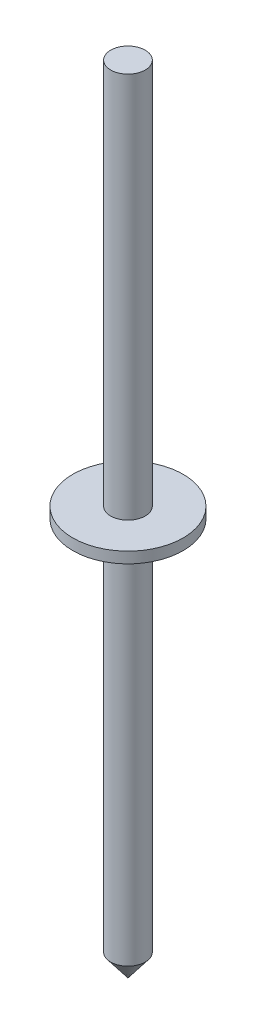
ISO-10303-21;
HEADER;
FILE_DESCRIPTION(('STEP AP214'),'2;1');
FILE_NAME('part.step','',(''),(''),'','','');
FILE_SCHEMA(('AUTOMOTIVE_DESIGN { 1 0 10303 214 1 1 1 1 }'));
ENDSEC;
DATA;
#1=APPLICATION_CONTEXT('core data for automotive mechanical design processes');
#2=APPLICATION_PROTOCOL_DEFINITION('international standard','automotive_design',2000,#1);
#3=PRODUCT_CONTEXT('',#1,'mechanical');
#4=PRODUCT('Part','Part','',(#3));
#5=PRODUCT_RELATED_PRODUCT_CATEGORY('part','',(#4));
#6=PRODUCT_DEFINITION_FORMATION('','',#4);
#7=PRODUCT_DEFINITION_CONTEXT('part definition',#1,'design');
#8=PRODUCT_DEFINITION('design','',#6,#7);
#9=PRODUCT_DEFINITION_SHAPE('','',#8);
#10=(LENGTH_UNIT() NAMED_UNIT(*) SI_UNIT(.MILLI.,.METRE.));
#11=(NAMED_UNIT(*) PLANE_ANGLE_UNIT() SI_UNIT($,.RADIAN.));
#12=(NAMED_UNIT(*) SI_UNIT($,.STERADIAN.) SOLID_ANGLE_UNIT());
#13=UNCERTAINTY_MEASURE_WITH_UNIT(LENGTH_MEASURE(1.E-05),#10,'distance_accuracy_value','');
#14=(GEOMETRIC_REPRESENTATION_CONTEXT(3) GLOBAL_UNCERTAINTY_ASSIGNED_CONTEXT((#13)) GLOBAL_UNIT_ASSIGNED_CONTEXT((#10,
#11,#12)) REPRESENTATION_CONTEXT('',''));
#15=CARTESIAN_POINT('',(0.,0.,0.));
#16=DIRECTION('',(0.,0.,1.));
#17=DIRECTION('',(1.,0.,0.));
#18=AXIS2_PLACEMENT_3D('',#15,#16,#17);
#19=CARTESIAN_POINT('',(0.,2.54,0.));
#20=DIRECTION('',(0.,1.,0.));
#21=DIRECTION('',(0.,0.,1.));
#22=AXIS2_PLACEMENT_3D('',#19,#20,#21);
#23=PLANE('',#22);
#24=CARTESIAN_POINT('',(0.,2.54,0.));
#25=DIRECTION('',(0.,1.,0.));
#26=DIRECTION('',(0.,0.,1.));
#27=AXIS2_PLACEMENT_3D('',#24,#25,#26);
#28=CIRCLE('',#27,12.7);
#29=CARTESIAN_POINT('',(0.,2.54,12.7));
#30=VERTEX_POINT('',#29);
#31=EDGE_CURVE('E11',#30,#30,#28,.T.);
#32=ORIENTED_EDGE('',*,*,#31,.T.);
#33=EDGE_LOOP('',(#32));
#34=FACE_BOUND('',#33,.T.);
#35=CARTESIAN_POINT('',(0.,2.54,0.));
#36=DIRECTION('',(0.,1.,0.));
#37=DIRECTION('',(0.,0.,1.));
#38=AXIS2_PLACEMENT_3D('',#35,#36,#37);
#39=CIRCLE('',#38,3.96875);
#40=CARTESIAN_POINT('',(0.,2.54,3.96875));
#41=VERTEX_POINT('',#40);
#42=EDGE_CURVE('E70',#41,#41,#39,.T.);
#43=ORIENTED_EDGE('',*,*,#42,.F.);
#44=EDGE_LOOP('',(#43));
#45=FACE_BOUND('',#44,.T.);
#46=ADVANCED_FACE('F39',(#34,#45),#23,.T.);
#47=CARTESIAN_POINT('',(0.,0.,0.));
#48=DIRECTION('',(0.,1.,0.));
#49=DIRECTION('',(0.,0.,1.));
#50=AXIS2_PLACEMENT_3D('',#47,#48,#49);
#51=PLANE('',#50);
#52=CARTESIAN_POINT('',(0.,0.,0.));
#53=DIRECTION('',(0.,1.,0.));
#54=DIRECTION('',(0.,0.,1.));
#55=AXIS2_PLACEMENT_3D('',#52,#53,#54);
#56=CIRCLE('',#55,12.7);
#57=CARTESIAN_POINT('',(0.,0.,12.7));
#58=VERTEX_POINT('',#57);
#59=EDGE_CURVE('E43',#58,#58,#56,.T.);
#60=ORIENTED_EDGE('',*,*,#59,.F.);
#61=EDGE_LOOP('',(#60));
#62=FACE_BOUND('',#61,.T.);
#63=CARTESIAN_POINT('',(0.,0.,0.));
#64=DIRECTION('',(0.,1.,0.));
#65=DIRECTION('',(0.,0.,1.));
#66=AXIS2_PLACEMENT_3D('',#63,#64,#65);
#67=CIRCLE('',#66,3.96875);
#68=CARTESIAN_POINT('',(0.,0.,3.96875));
#69=VERTEX_POINT('',#68);
#70=EDGE_CURVE('E64',#69,#69,#67,.T.);
#71=ORIENTED_EDGE('',*,*,#70,.T.);
#72=EDGE_LOOP('',(#71));
#73=FACE_BOUND('',#72,.T.);
#74=ADVANCED_FACE('F80',(#62,#73),#51,.F.);
#75=CARTESIAN_POINT('',(0.,2.54,0.));
#76=DIRECTION('',(0.,-1.,0.));
#77=DIRECTION('',(0.,0.,-1.));
#78=AXIS2_PLACEMENT_3D('',#75,#76,#77);
#79=CYLINDRICAL_SURFACE('',#78,12.7);
#80=ORIENTED_EDGE('',*,*,#31,.F.);
#81=EDGE_LOOP('',(#80));
#82=FACE_BOUND('',#81,.T.);
#83=ORIENTED_EDGE('',*,*,#59,.T.);
#84=EDGE_LOOP('',(#83));
#85=FACE_BOUND('',#84,.T.);
#86=ADVANCED_FACE('F41',(#82,#85),#79,.T.);
#87=CARTESIAN_POINT('',(0.,-86.36,0.));
#88=DIRECTION('',(0.,1.,0.));
#89=DIRECTION('',(0.,0.,1.));
#90=AXIS2_PLACEMENT_3D('',#87,#88,#89);
#91=CYLINDRICAL_SURFACE('',#90,3.96875);
#92=CARTESIAN_POINT('',(0.,-86.36,0.));
#93=DIRECTION('',(0.,-1.,0.));
#94=DIRECTION('',(0.,0.,-1.));
#95=AXIS2_PLACEMENT_3D('',#92,#93,#94);
#96=CIRCLE('',#95,3.96875);
#97=CARTESIAN_POINT('',(0.,-86.36,-3.96875));
#98=VERTEX_POINT('',#97);
#99=EDGE_CURVE('E57',#98,#98,#96,.T.);
#100=ORIENTED_EDGE('',*,*,#99,.F.);
#101=EDGE_LOOP('',(#100));
#102=FACE_BOUND('',#101,.T.);
#103=ORIENTED_EDGE('',*,*,#70,.F.);
#104=EDGE_LOOP('',(#103));
#105=FACE_BOUND('',#104,.T.);
#106=ADVANCED_FACE('F85',(#102,#105),#91,.T.);
#107=ORIENTED_EDGE('',*,*,#42,.T.);
#108=EDGE_LOOP('',(#107));
#109=FACE_BOUND('',#108,.T.);
#110=CARTESIAN_POINT('',(0.,91.44,0.));
#111=DIRECTION('',(0.,1.,0.));
#112=DIRECTION('',(0.,0.,1.));
#113=AXIS2_PLACEMENT_3D('',#110,#111,#112);
#114=CIRCLE('',#113,3.96875);
#115=CARTESIAN_POINT('',(0.,91.44,3.96875));
#116=VERTEX_POINT('',#115);
#117=EDGE_CURVE('E60',#116,#116,#114,.T.);
#118=ORIENTED_EDGE('',*,*,#117,.F.);
#119=EDGE_LOOP('',(#118));
#120=FACE_BOUND('',#119,.T.);
#121=ADVANCED_FACE('F87',(#109,#120),#91,.T.);
#122=CARTESIAN_POINT('',(0.,91.44,0.));
#123=DIRECTION('',(0.,1.,0.));
#124=DIRECTION('',(0.,0.,1.));
#125=AXIS2_PLACEMENT_3D('',#122,#123,#124);
#126=PLANE('',#125);
#127=ORIENTED_EDGE('',*,*,#117,.T.);
#128=EDGE_LOOP('',(#127));
#129=FACE_BOUND('',#128,.T.);
#130=ADVANCED_FACE('F53',(#129),#126,.T.);
#131=CARTESIAN_POINT('',(0.,-86.36,0.));
#132=DIRECTION('',(0.,1.,0.));
#133=DIRECTION('',(0.,0.,1.));
#134=AXIS2_PLACEMENT_3D('',#131,#132,#133);
#135=CONICAL_SURFACE('',#134,3.96875,0.655898623560453);
#136=CARTESIAN_POINT('',(0.,-91.5172083850429,0.));
#137=VERTEX_POINT('',#136);
#138=VERTEX_LOOP('',#137);
#139=FACE_BOUND('',#138,.T.);
#140=ORIENTED_EDGE('',*,*,#99,.T.);
#141=EDGE_LOOP('',(#140));
#142=FACE_BOUND('',#141,.T.);
#143=ADVANCED_FACE('F50',(#139,#142),#135,.T.);
#144=CLOSED_SHELL('',(#46,#74,#86,#106,#121,#130,#143));
#145=MANIFOLD_SOLID_BREP('B2',#144);
#146=ADVANCED_BREP_SHAPE_REPRESENTATION('',(#18,#145),#14);
#147=SHAPE_DEFINITION_REPRESENTATION(#9,#146);
ENDSEC;
END-ISO-10303-21;
